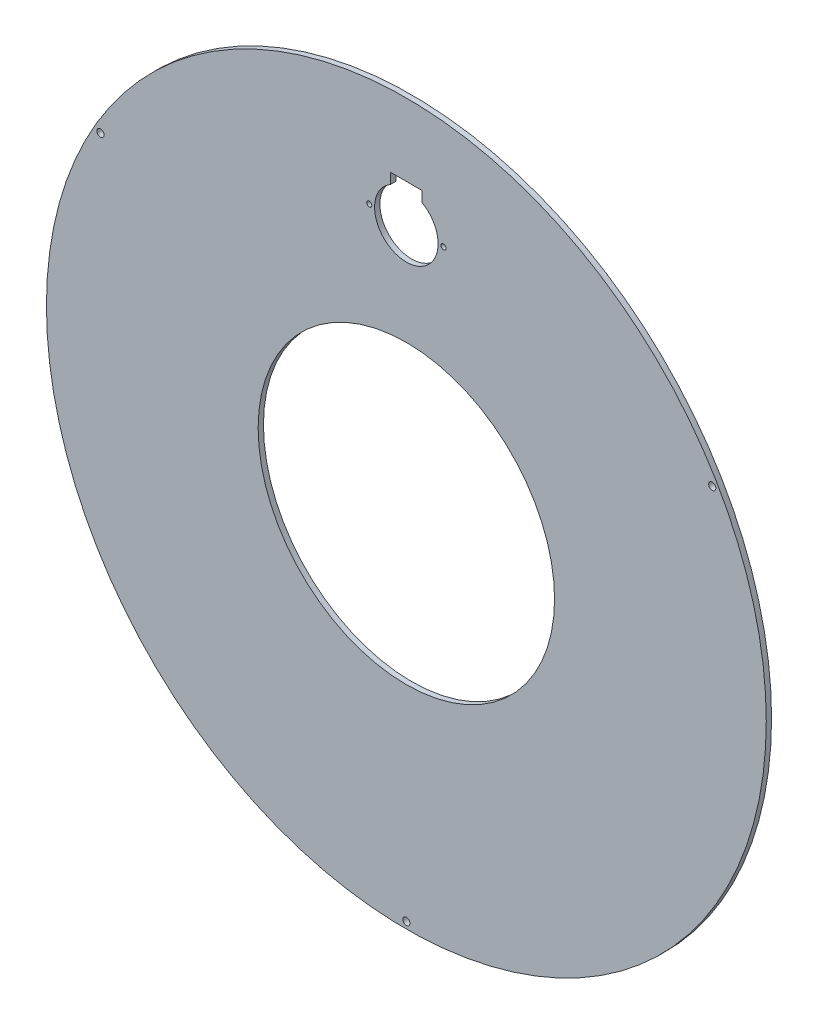
ISO-10303-21;
HEADER;
FILE_DESCRIPTION(('STEP AP214'),'2;1');
FILE_NAME('part.step','',(''),(''),'','','');
FILE_SCHEMA(('AUTOMOTIVE_DESIGN { 1 0 10303 214 1 1 1 1 }'));
ENDSEC;
DATA;
#1=APPLICATION_CONTEXT('core data for automotive mechanical design processes');
#2=APPLICATION_PROTOCOL_DEFINITION('international standard','automotive_design',2000,#1);
#3=PRODUCT_CONTEXT('',#1,'mechanical');
#4=PRODUCT('Part','Part','',(#3));
#5=PRODUCT_RELATED_PRODUCT_CATEGORY('part','',(#4));
#6=PRODUCT_DEFINITION_FORMATION('','',#4);
#7=PRODUCT_DEFINITION_CONTEXT('part definition',#1,'design');
#8=PRODUCT_DEFINITION('design','',#6,#7);
#9=PRODUCT_DEFINITION_SHAPE('','',#8);
#10=(LENGTH_UNIT() NAMED_UNIT(*) SI_UNIT(.MILLI.,.METRE.));
#11=(NAMED_UNIT(*) PLANE_ANGLE_UNIT() SI_UNIT($,.RADIAN.));
#12=(NAMED_UNIT(*) SI_UNIT($,.STERADIAN.) SOLID_ANGLE_UNIT());
#13=UNCERTAINTY_MEASURE_WITH_UNIT(LENGTH_MEASURE(1.E-05),#10,'distance_accuracy_value','');
#14=(GEOMETRIC_REPRESENTATION_CONTEXT(3) GLOBAL_UNCERTAINTY_ASSIGNED_CONTEXT((#13)) GLOBAL_UNIT_ASSIGNED_CONTEXT((#10,
#11,#12)) REPRESENTATION_CONTEXT('',''));
#15=CARTESIAN_POINT('',(0.,0.,0.));
#16=DIRECTION('',(0.,0.,1.));
#17=DIRECTION('',(1.,0.,0.));
#18=AXIS2_PLACEMENT_3D('',#15,#16,#17);
#19=CARTESIAN_POINT('',(0.,0.,2.5));
#20=DIRECTION('',(0.,0.,1.));
#21=DIRECTION('',(1.,0.,0.));
#22=AXIS2_PLACEMENT_3D('',#19,#20,#21);
#23=PLANE('',#22);
#24=CARTESIAN_POINT('',(-144.479332099006,83.4151812796966,2.5));
#25=DIRECTION('',(0.,0.,1.));
#26=DIRECTION('',(1.,0.,0.));
#27=AXIS2_PLACEMENT_3D('',#24,#25,#26);
#28=CIRCLE('',#27,1.70000000000001);
#29=CARTESIAN_POINT('',(-142.779332099006,83.4151812796966,2.5));
#30=VERTEX_POINT('',#29);
#31=EDGE_CURVE('E140',#30,#30,#28,.T.);
#32=ORIENTED_EDGE('',*,*,#31,.F.);
#33=EDGE_LOOP('',(#32));
#34=FACE_BOUND('',#33,.T.);
#35=CARTESIAN_POINT('',(144.479332099005,83.4151812796986,2.5));
#36=DIRECTION('',(0.,0.,1.));
#37=DIRECTION('',(1.,0.,0.));
#38=AXIS2_PLACEMENT_3D('',#35,#36,#37);
#39=CIRCLE('',#38,1.70000000000001);
#40=CARTESIAN_POINT('',(146.179332099005,83.4151812796986,2.5));
#41=VERTEX_POINT('',#40);
#42=EDGE_CURVE('E144',#41,#41,#39,.T.);
#43=ORIENTED_EDGE('',*,*,#42,.F.);
#44=EDGE_LOOP('',(#43));
#45=FACE_BOUND('',#44,.T.);
#46=CARTESIAN_POINT('',(0.,-166.830362559396,2.5));
#47=DIRECTION('',(0.,0.,1.));
#48=DIRECTION('',(1.,0.,0.));
#49=AXIS2_PLACEMENT_3D('',#46,#47,#48);
#50=CIRCLE('',#49,1.7);
#51=CARTESIAN_POINT('',(1.7,-166.830362559396,2.5));
#52=VERTEX_POINT('',#51);
#53=EDGE_CURVE('E148',#52,#52,#50,.T.);
#54=ORIENTED_EDGE('',*,*,#53,.F.);
#55=EDGE_LOOP('',(#54));
#56=FACE_BOUND('',#55,.T.);
#57=CARTESIAN_POINT('',(17.5116643121777,117.848267331419,2.5));
#58=DIRECTION('',(0.,0.,1.));
#59=DIRECTION('',(1.,0.,0.));
#60=AXIS2_PLACEMENT_3D('',#57,#58,#59);
#61=CIRCLE('',#60,1.2);
#62=CARTESIAN_POINT('',(18.7116643121777,117.848267331419,2.5));
#63=VERTEX_POINT('',#62);
#64=EDGE_CURVE('E152',#63,#63,#61,.T.);
#65=ORIENTED_EDGE('',*,*,#64,.F.);
#66=EDGE_LOOP('',(#65));
#67=FACE_BOUND('',#66,.T.);
#68=CARTESIAN_POINT('',(-17.5116643121777,117.848267331419,2.5));
#69=DIRECTION('',(0.,0.,1.));
#70=DIRECTION('',(1.,0.,0.));
#71=AXIS2_PLACEMENT_3D('',#68,#69,#70);
#72=CIRCLE('',#71,1.2);
#73=CARTESIAN_POINT('',(-16.3116643121777,117.848267331419,2.5));
#74=VERTEX_POINT('',#73);
#75=EDGE_CURVE('E155',#74,#74,#72,.T.);
#76=ORIENTED_EDGE('',*,*,#75,.F.);
#77=EDGE_LOOP('',(#76));
#78=FACE_BOUND('',#77,.T.);
#79=CARTESIAN_POINT('',(0.,117.85,2.5));
#80=DIRECTION('',(0.,0.,1.));
#81=DIRECTION('',(1.,0.,0.));
#82=AXIS2_PLACEMENT_3D('',#79,#80,#81);
#83=CIRCLE('',#82,15.);
#84=CARTESIAN_POINT('',(-7.5,130.840381056767,2.5));
#85=VERTEX_POINT('',#84);
#86=CARTESIAN_POINT('',(7.5,130.840381056767,2.5));
#87=VERTEX_POINT('',#86);
#88=EDGE_CURVE('E53',#85,#87,#83,.T.);
#89=ORIENTED_EDGE('',*,*,#88,.F.);
#90=DIRECTION('',(0.,-1.,0.));
#91=VECTOR('',#90,1.);
#92=CARTESIAN_POINT('',(-7.5,135.840381056767,2.5));
#93=LINE('',#92,#91);
#94=CARTESIAN_POINT('',(-7.5,135.840381056767,2.5));
#95=VERTEX_POINT('',#94);
#96=EDGE_CURVE('E97',#95,#85,#93,.T.);
#97=ORIENTED_EDGE('',*,*,#96,.F.);
#98=DIRECTION('',(-1.,0.,0.));
#99=VECTOR('',#98,1.);
#100=CARTESIAN_POINT('',(7.5,135.840381056767,2.5));
#101=LINE('',#100,#99);
#102=CARTESIAN_POINT('',(7.5,135.840381056767,2.5));
#103=VERTEX_POINT('',#102);
#104=EDGE_CURVE('E82',#103,#95,#101,.T.);
#105=ORIENTED_EDGE('',*,*,#104,.F.);
#106=DIRECTION('',(0.,1.,0.));
#107=VECTOR('',#106,1.);
#108=CARTESIAN_POINT('',(7.5,135.840381056767,2.5));
#109=LINE('',#108,#107);
#110=EDGE_CURVE('E91',#87,#103,#109,.T.);
#111=ORIENTED_EDGE('',*,*,#110,.F.);
#112=EDGE_LOOP('',(#89,#97,#105,#111));
#113=FACE_BOUND('',#112,.T.);
#114=CARTESIAN_POINT('',(0.,0.,2.5));
#115=DIRECTION('',(0.,0.,1.));
#116=DIRECTION('',(1.,0.,0.));
#117=AXIS2_PLACEMENT_3D('',#114,#115,#116);
#118=CIRCLE('',#117,170.);
#119=CARTESIAN_POINT('',(170.,0.,2.5));
#120=VERTEX_POINT('',#119);
#121=EDGE_CURVE('E11',#120,#120,#118,.T.);
#122=ORIENTED_EDGE('',*,*,#121,.T.);
#123=EDGE_LOOP('',(#122));
#124=FACE_BOUND('',#123,.T.);
#125=CARTESIAN_POINT('',(0.,0.,2.5));
#126=DIRECTION('',(0.,0.,1.));
#127=DIRECTION('',(1.,0.,0.));
#128=AXIS2_PLACEMENT_3D('',#125,#126,#127);
#129=CIRCLE('',#128,70.);
#130=CARTESIAN_POINT('',(70.,0.,2.5));
#131=VERTEX_POINT('',#130);
#132=EDGE_CURVE('E110',#131,#131,#129,.T.);
#133=ORIENTED_EDGE('',*,*,#132,.F.);
#134=EDGE_LOOP('',(#133));
#135=FACE_BOUND('',#134,.T.);
#136=ADVANCED_FACE('F38',(#34,#45,#56,#67,#78,#113,#124,#135),#23,.T.);
#137=CARTESIAN_POINT('',(0.,0.,0.));
#138=DIRECTION('',(0.,0.,1.));
#139=DIRECTION('',(1.,0.,0.));
#140=AXIS2_PLACEMENT_3D('',#137,#138,#139);
#141=PLANE('',#140);
#142=CARTESIAN_POINT('',(-144.479332099006,83.4151812796966,0.));
#143=DIRECTION('',(0.,0.,1.));
#144=DIRECTION('',(1.,0.,0.));
#145=AXIS2_PLACEMENT_3D('',#142,#143,#144);
#146=CIRCLE('',#145,1.70000000000001);
#147=CARTESIAN_POINT('',(-142.779332099006,83.4151812796966,0.));
#148=VERTEX_POINT('',#147);
#149=EDGE_CURVE('E221',#148,#148,#146,.T.);
#150=ORIENTED_EDGE('',*,*,#149,.T.);
#151=EDGE_LOOP('',(#150));
#152=FACE_BOUND('',#151,.T.);
#153=CARTESIAN_POINT('',(144.479332099005,83.4151812796986,0.));
#154=DIRECTION('',(0.,0.,1.));
#155=DIRECTION('',(1.,0.,0.));
#156=AXIS2_PLACEMENT_3D('',#153,#154,#155);
#157=CIRCLE('',#156,1.70000000000001);
#158=CARTESIAN_POINT('',(146.179332099005,83.4151812796986,0.));
#159=VERTEX_POINT('',#158);
#160=EDGE_CURVE('E226',#159,#159,#157,.T.);
#161=ORIENTED_EDGE('',*,*,#160,.T.);
#162=EDGE_LOOP('',(#161));
#163=FACE_BOUND('',#162,.T.);
#164=CARTESIAN_POINT('',(0.,-166.830362559396,0.));
#165=DIRECTION('',(0.,0.,1.));
#166=DIRECTION('',(1.,0.,0.));
#167=AXIS2_PLACEMENT_3D('',#164,#165,#166);
#168=CIRCLE('',#167,1.7);
#169=CARTESIAN_POINT('',(1.7,-166.830362559396,0.));
#170=VERTEX_POINT('',#169);
#171=EDGE_CURVE('E230',#170,#170,#168,.T.);
#172=ORIENTED_EDGE('',*,*,#171,.T.);
#173=EDGE_LOOP('',(#172));
#174=FACE_BOUND('',#173,.T.);
#175=CARTESIAN_POINT('',(17.5116643121777,117.848267331419,0.));
#176=DIRECTION('',(0.,0.,1.));
#177=DIRECTION('',(1.,0.,0.));
#178=AXIS2_PLACEMENT_3D('',#175,#176,#177);
#179=CIRCLE('',#178,1.2);
#180=CARTESIAN_POINT('',(18.7116643121777,117.848267331419,0.));
#181=VERTEX_POINT('',#180);
#182=EDGE_CURVE('E158',#181,#181,#179,.T.);
#183=ORIENTED_EDGE('',*,*,#182,.T.);
#184=EDGE_LOOP('',(#183));
#185=FACE_BOUND('',#184,.T.);
#186=CARTESIAN_POINT('',(-17.5116643121777,117.848267331419,0.));
#187=DIRECTION('',(0.,0.,1.));
#188=DIRECTION('',(1.,0.,0.));
#189=AXIS2_PLACEMENT_3D('',#186,#187,#188);
#190=CIRCLE('',#189,1.2);
#191=CARTESIAN_POINT('',(-16.3116643121777,117.848267331419,0.));
#192=VERTEX_POINT('',#191);
#193=EDGE_CURVE('E157',#192,#192,#190,.T.);
#194=ORIENTED_EDGE('',*,*,#193,.T.);
#195=EDGE_LOOP('',(#194));
#196=FACE_BOUND('',#195,.T.);
#197=DIRECTION('',(0.,1.,0.));
#198=VECTOR('',#197,1.);
#199=CARTESIAN_POINT('',(-7.5,135.840381056767,0.));
#200=LINE('',#199,#198);
#201=CARTESIAN_POINT('',(-7.5,130.840381056767,0.));
#202=VERTEX_POINT('',#201);
#203=CARTESIAN_POINT('',(-7.5,135.840381056767,0.));
#204=VERTEX_POINT('',#203);
#205=EDGE_CURVE('E167',#202,#204,#200,.T.);
#206=ORIENTED_EDGE('',*,*,#205,.F.);
#207=CARTESIAN_POINT('',(0.,117.85,0.));
#208=DIRECTION('',(0.,0.,1.));
#209=DIRECTION('',(1.,0.,0.));
#210=AXIS2_PLACEMENT_3D('',#207,#208,#209);
#211=CIRCLE('',#210,15.);
#212=CARTESIAN_POINT('',(7.5,130.840381056767,0.));
#213=VERTEX_POINT('',#212);
#214=EDGE_CURVE('E109',#213,#202,#211,.F.);
#215=ORIENTED_EDGE('',*,*,#214,.F.);
#216=DIRECTION('',(0.,-1.,0.));
#217=VECTOR('',#216,1.);
#218=CARTESIAN_POINT('',(7.5,135.840381056767,0.));
#219=LINE('',#218,#217);
#220=CARTESIAN_POINT('',(7.5,135.840381056767,0.));
#221=VERTEX_POINT('',#220);
#222=EDGE_CURVE('E106',#221,#213,#219,.T.);
#223=ORIENTED_EDGE('',*,*,#222,.F.);
#224=DIRECTION('',(1.,0.,0.));
#225=VECTOR('',#224,1.);
#226=CARTESIAN_POINT('',(7.5,135.840381056767,0.));
#227=LINE('',#226,#225);
#228=EDGE_CURVE('E85',#204,#221,#227,.T.);
#229=ORIENTED_EDGE('',*,*,#228,.F.);
#230=EDGE_LOOP('',(#206,#215,#223,#229));
#231=FACE_BOUND('',#230,.T.);
#232=CARTESIAN_POINT('',(0.,0.,0.));
#233=DIRECTION('',(0.,0.,1.));
#234=DIRECTION('',(1.,0.,0.));
#235=AXIS2_PLACEMENT_3D('',#232,#233,#234);
#236=CIRCLE('',#235,170.);
#237=CARTESIAN_POINT('',(170.,0.,0.));
#238=VERTEX_POINT('',#237);
#239=EDGE_CURVE('E42',#238,#238,#236,.T.);
#240=ORIENTED_EDGE('',*,*,#239,.F.);
#241=EDGE_LOOP('',(#240));
#242=FACE_BOUND('',#241,.T.);
#243=CARTESIAN_POINT('',(0.,0.,0.));
#244=DIRECTION('',(0.,0.,1.));
#245=DIRECTION('',(1.,0.,0.));
#246=AXIS2_PLACEMENT_3D('',#243,#244,#245);
#247=CIRCLE('',#246,70.);
#248=CARTESIAN_POINT('',(70.,0.,0.));
#249=VERTEX_POINT('',#248);
#250=EDGE_CURVE('E108',#249,#249,#247,.T.);
#251=ORIENTED_EDGE('',*,*,#250,.T.);
#252=EDGE_LOOP('',(#251));
#253=FACE_BOUND('',#252,.T.);
#254=ADVANCED_FACE('F116',(#152,#163,#174,#185,#196,#231,#242,#253),#141,.F.);
#255=CARTESIAN_POINT('',(0.,0.,2.5));
#256=DIRECTION('',(0.,0.,-1.));
#257=DIRECTION('',(-1.,0.,0.));
#258=AXIS2_PLACEMENT_3D('',#255,#256,#257);
#259=CYLINDRICAL_SURFACE('',#258,170.);
#260=ORIENTED_EDGE('',*,*,#121,.F.);
#261=EDGE_LOOP('',(#260));
#262=FACE_BOUND('',#261,.T.);
#263=ORIENTED_EDGE('',*,*,#239,.T.);
#264=EDGE_LOOP('',(#263));
#265=FACE_BOUND('',#264,.T.);
#266=ADVANCED_FACE('F40',(#262,#265),#259,.T.);
#267=CARTESIAN_POINT('',(0.,0.,2.5));
#268=DIRECTION('',(0.,0.,-1.));
#269=DIRECTION('',(-1.,0.,0.));
#270=AXIS2_PLACEMENT_3D('',#267,#268,#269);
#271=CYLINDRICAL_SURFACE('',#270,70.);
#272=ORIENTED_EDGE('',*,*,#132,.T.);
#273=EDGE_LOOP('',(#272));
#274=FACE_BOUND('',#273,.T.);
#275=ORIENTED_EDGE('',*,*,#250,.F.);
#276=EDGE_LOOP('',(#275));
#277=FACE_BOUND('',#276,.T.);
#278=ADVANCED_FACE('F118',(#274,#277),#271,.F.);
#279=CARTESIAN_POINT('',(0.,117.85,-44.591089269838));
#280=DIRECTION('',(0.,0.,1.));
#281=DIRECTION('',(1.,0.,0.));
#282=AXIS2_PLACEMENT_3D('',#279,#280,#281);
#283=CYLINDRICAL_SURFACE('',#282,15.);
#284=ORIENTED_EDGE('',*,*,#214,.T.);
#285=DIRECTION('',(0.,0.,1.));
#286=VECTOR('',#285,1.);
#287=CARTESIAN_POINT('',(-7.5,130.840381056767,-44.591089269838));
#288=LINE('',#287,#286);
#289=EDGE_CURVE('E102',#202,#85,#288,.T.);
#290=ORIENTED_EDGE('',*,*,#289,.T.);
#291=ORIENTED_EDGE('',*,*,#88,.T.);
#292=DIRECTION('',(0.,0.,1.));
#293=VECTOR('',#292,1.);
#294=CARTESIAN_POINT('',(7.5,130.840381056767,-44.591089269838));
#295=LINE('',#294,#293);
#296=EDGE_CURVE('E88',#213,#87,#295,.T.);
#297=ORIENTED_EDGE('',*,*,#296,.F.);
#298=EDGE_LOOP('',(#284,#290,#291,#297));
#299=FACE_BOUND('',#298,.T.);
#300=ADVANCED_FACE('F120',(#299),#283,.F.);
#301=CARTESIAN_POINT('',(-7.5,135.840381056767,-44.591089269838));
#302=DIRECTION('',(-1.,0.,0.));
#303=DIRECTION('',(0.,-1.,0.));
#304=AXIS2_PLACEMENT_3D('',#301,#302,#303);
#305=PLANE('',#304);
#306=ORIENTED_EDGE('',*,*,#205,.T.);
#307=DIRECTION('',(0.,0.,1.));
#308=VECTOR('',#307,1.);
#309=CARTESIAN_POINT('',(-7.5,135.840381056767,-44.591089269838));
#310=LINE('',#309,#308);
#311=EDGE_CURVE('E87',#204,#95,#310,.T.);
#312=ORIENTED_EDGE('',*,*,#311,.T.);
#313=ORIENTED_EDGE('',*,*,#96,.T.);
#314=ORIENTED_EDGE('',*,*,#289,.F.);
#315=EDGE_LOOP('',(#306,#312,#313,#314));
#316=FACE_BOUND('',#315,.T.);
#317=ADVANCED_FACE('F127',(#316),#305,.F.);
#318=CARTESIAN_POINT('',(7.5,135.840381056767,-44.591089269838));
#319=DIRECTION('',(0.,1.,0.));
#320=DIRECTION('',(0.,0.,1.));
#321=AXIS2_PLACEMENT_3D('',#318,#319,#320);
#322=PLANE('',#321);
#323=ORIENTED_EDGE('',*,*,#228,.T.);
#324=DIRECTION('',(0.,0.,1.));
#325=VECTOR('',#324,1.);
#326=CARTESIAN_POINT('',(7.5,135.840381056767,-44.591089269838));
#327=LINE('',#326,#325);
#328=EDGE_CURVE('E61',#221,#103,#327,.T.);
#329=ORIENTED_EDGE('',*,*,#328,.T.);
#330=ORIENTED_EDGE('',*,*,#104,.T.);
#331=ORIENTED_EDGE('',*,*,#311,.F.);
#332=EDGE_LOOP('',(#323,#329,#330,#331));
#333=FACE_BOUND('',#332,.T.);
#334=ADVANCED_FACE('F79',(#333),#322,.F.);
#335=CARTESIAN_POINT('',(7.5,135.840381056767,-44.591089269838));
#336=DIRECTION('',(1.,0.,0.));
#337=DIRECTION('',(0.,1.,0.));
#338=AXIS2_PLACEMENT_3D('',#335,#336,#337);
#339=PLANE('',#338);
#340=ORIENTED_EDGE('',*,*,#222,.T.);
#341=ORIENTED_EDGE('',*,*,#296,.T.);
#342=ORIENTED_EDGE('',*,*,#110,.T.);
#343=ORIENTED_EDGE('',*,*,#328,.F.);
#344=EDGE_LOOP('',(#340,#341,#342,#343));
#345=FACE_BOUND('',#344,.T.);
#346=ADVANCED_FACE('F92',(#345),#339,.F.);
#347=CARTESIAN_POINT('',(-17.5116643121777,117.848267331419,2.5));
#348=DIRECTION('',(0.,0.,1.));
#349=DIRECTION('',(1.,0.,0.));
#350=AXIS2_PLACEMENT_3D('',#347,#348,#349);
#351=CYLINDRICAL_SURFACE('',#350,1.2);
#352=ORIENTED_EDGE('',*,*,#193,.F.);
#353=EDGE_LOOP('',(#352));
#354=FACE_BOUND('',#353,.T.);
#355=ORIENTED_EDGE('',*,*,#75,.T.);
#356=EDGE_LOOP('',(#355));
#357=FACE_BOUND('',#356,.T.);
#358=ADVANCED_FACE('F185',(#354,#357),#351,.F.);
#359=CARTESIAN_POINT('',(17.5116643121777,117.848267331419,2.5));
#360=DIRECTION('',(0.,0.,1.));
#361=DIRECTION('',(1.,0.,0.));
#362=AXIS2_PLACEMENT_3D('',#359,#360,#361);
#363=CYLINDRICAL_SURFACE('',#362,1.2);
#364=ORIENTED_EDGE('',*,*,#182,.F.);
#365=EDGE_LOOP('',(#364));
#366=FACE_BOUND('',#365,.T.);
#367=ORIENTED_EDGE('',*,*,#64,.T.);
#368=EDGE_LOOP('',(#367));
#369=FACE_BOUND('',#368,.T.);
#370=ADVANCED_FACE('F192',(#366,#369),#363,.F.);
#371=CARTESIAN_POINT('',(0.,-166.830362559396,2.5));
#372=DIRECTION('',(0.,0.,1.));
#373=DIRECTION('',(1.,0.,0.));
#374=AXIS2_PLACEMENT_3D('',#371,#372,#373);
#375=CYLINDRICAL_SURFACE('',#374,1.7);
#376=ORIENTED_EDGE('',*,*,#171,.F.);
#377=EDGE_LOOP('',(#376));
#378=FACE_BOUND('',#377,.T.);
#379=ORIENTED_EDGE('',*,*,#53,.T.);
#380=EDGE_LOOP('',(#379));
#381=FACE_BOUND('',#380,.T.);
#382=ADVANCED_FACE('F197',(#378,#381),#375,.F.);
#383=CARTESIAN_POINT('',(144.479332099005,83.4151812796986,2.5));
#384=DIRECTION('',(0.,0.,1.));
#385=DIRECTION('',(1.,0.,0.));
#386=AXIS2_PLACEMENT_3D('',#383,#384,#385);
#387=CYLINDRICAL_SURFACE('',#386,1.70000000000001);
#388=ORIENTED_EDGE('',*,*,#160,.F.);
#389=EDGE_LOOP('',(#388));
#390=FACE_BOUND('',#389,.T.);
#391=ORIENTED_EDGE('',*,*,#42,.T.);
#392=EDGE_LOOP('',(#391));
#393=FACE_BOUND('',#392,.T.);
#394=ADVANCED_FACE('F204',(#390,#393),#387,.F.);
#395=CARTESIAN_POINT('',(-144.479332099006,83.4151812796966,2.5));
#396=DIRECTION('',(0.,0.,1.));
#397=DIRECTION('',(1.,0.,0.));
#398=AXIS2_PLACEMENT_3D('',#395,#396,#397);
#399=CYLINDRICAL_SURFACE('',#398,1.70000000000001);
#400=ORIENTED_EDGE('',*,*,#149,.F.);
#401=EDGE_LOOP('',(#400));
#402=FACE_BOUND('',#401,.T.);
#403=ORIENTED_EDGE('',*,*,#31,.T.);
#404=EDGE_LOOP('',(#403));
#405=FACE_BOUND('',#404,.T.);
#406=ADVANCED_FACE('F212',(#402,#405),#399,.F.);
#407=CLOSED_SHELL('',(#136,#254,#266,#278,#300,#317,#334,#346,#358,#370,#382,#394,#406));
#408=MANIFOLD_SOLID_BREP('B2',#407);
#409=ADVANCED_BREP_SHAPE_REPRESENTATION('',(#18,#408),#14);
#410=SHAPE_DEFINITION_REPRESENTATION(#9,#409);
ENDSEC;
END-ISO-10303-21;
